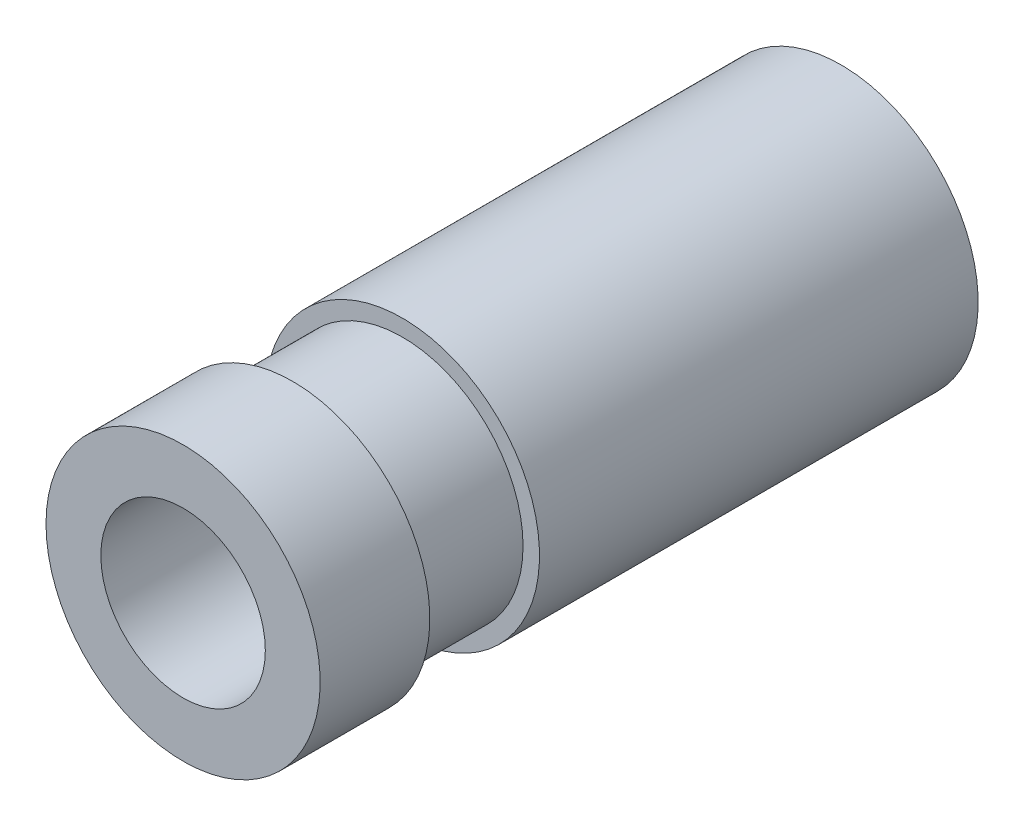
ISO-10303-21;
HEADER;
FILE_DESCRIPTION(('STEP AP214'),'2;1');
FILE_NAME('part.step','',(''),(''),'','','');
FILE_SCHEMA(('AUTOMOTIVE_DESIGN { 1 0 10303 214 1 1 1 1 }'));
ENDSEC;
DATA;
#1=APPLICATION_CONTEXT('core data for automotive mechanical design processes');
#2=APPLICATION_PROTOCOL_DEFINITION('international standard','automotive_design',2000,#1);
#3=PRODUCT_CONTEXT('',#1,'mechanical');
#4=PRODUCT('Part','Part','',(#3));
#5=PRODUCT_RELATED_PRODUCT_CATEGORY('part','',(#4));
#6=PRODUCT_DEFINITION_FORMATION('','',#4);
#7=PRODUCT_DEFINITION_CONTEXT('part definition',#1,'design');
#8=PRODUCT_DEFINITION('design','',#6,#7);
#9=PRODUCT_DEFINITION_SHAPE('','',#8);
#10=(LENGTH_UNIT() NAMED_UNIT(*) SI_UNIT(.MILLI.,.METRE.));
#11=(NAMED_UNIT(*) PLANE_ANGLE_UNIT() SI_UNIT($,.RADIAN.));
#12=(NAMED_UNIT(*) SI_UNIT($,.STERADIAN.) SOLID_ANGLE_UNIT());
#13=UNCERTAINTY_MEASURE_WITH_UNIT(LENGTH_MEASURE(1.E-05),#10,'distance_accuracy_value','');
#14=(GEOMETRIC_REPRESENTATION_CONTEXT(3) GLOBAL_UNCERTAINTY_ASSIGNED_CONTEXT((#13)) GLOBAL_UNIT_ASSIGNED_CONTEXT((#10,
#11,#12)) REPRESENTATION_CONTEXT('',''));
#15=CARTESIAN_POINT('',(0.,0.,0.));
#16=DIRECTION('',(0.,0.,1.));
#17=DIRECTION('',(1.,0.,0.));
#18=AXIS2_PLACEMENT_3D('',#15,#16,#17);
#19=CARTESIAN_POINT('',(0.,0.,7.62));
#20=DIRECTION('',(0.,0.,-1.));
#21=DIRECTION('',(-1.,0.,0.));
#22=AXIS2_PLACEMENT_3D('',#19,#20,#21);
#23=CYLINDRICAL_SURFACE('',#22,1.5875);
#24=CARTESIAN_POINT('',(0.,0.,0.));
#25=DIRECTION('',(0.,0.,1.));
#26=DIRECTION('',(1.,0.,0.));
#27=AXIS2_PLACEMENT_3D('',#24,#25,#26);
#28=CIRCLE('',#27,1.5875);
#29=CARTESIAN_POINT('',(-1.5875,0.,0.));
#30=VERTEX_POINT('',#29);
#31=EDGE_CURVE('E41',#30,#30,#28,.T.);
#32=CARTESIAN_POINT('',(0.,0.,5.08));
#33=DIRECTION('',(0.,0.,1.));
#34=DIRECTION('',(1.,0.,0.));
#35=AXIS2_PLACEMENT_3D('',#32,#33,#34);
#36=CIRCLE('',#35,1.5875);
#37=CARTESIAN_POINT('',(-1.5875,0.,5.08));
#38=VERTEX_POINT('',#37);
#39=EDGE_CURVE('E53',#38,#38,#36,.T.);
#40=CARTESIAN_POINT('',(-1.5875,0.,0.));
#41=CARTESIAN_POINT('',(-1.5875,0.,0.0529166666666667));
#42=CARTESIAN_POINT('',(-1.5875,0.,0.105833333333333));
#43=CARTESIAN_POINT('',(-1.5875,0.,0.211666666666667));
#44=CARTESIAN_POINT('',(-1.5875,0.,0.264583333333333));
#45=CARTESIAN_POINT('',(-1.5875,0.,0.370416666666667));
#46=CARTESIAN_POINT('',(-1.5875,0.,0.423333333333333));
#47=CARTESIAN_POINT('',(-1.5875,0.,0.529166666666667));
#48=CARTESIAN_POINT('',(-1.5875,0.,0.582083333333333));
#49=CARTESIAN_POINT('',(-1.5875,0.,0.687916666666667));
#50=CARTESIAN_POINT('',(-1.5875,0.,0.740833333333333));
#51=CARTESIAN_POINT('',(-1.5875,0.,0.846666666666666));
#52=CARTESIAN_POINT('',(-1.5875,0.,0.899583333333333));
#53=CARTESIAN_POINT('',(-1.5875,0.,1.00541666666667));
#54=CARTESIAN_POINT('',(-1.5875,0.,1.05833333333333));
#55=CARTESIAN_POINT('',(-1.5875,0.,1.16416666666667));
#56=CARTESIAN_POINT('',(-1.5875,0.,1.21708333333333));
#57=CARTESIAN_POINT('',(-1.5875,0.,1.32291666666667));
#58=CARTESIAN_POINT('',(-1.5875,0.,1.37583333333333));
#59=CARTESIAN_POINT('',(-1.5875,0.,1.48166666666667));
#60=CARTESIAN_POINT('',(-1.5875,0.,1.53458333333333));
#61=CARTESIAN_POINT('',(-1.5875,0.,1.64041666666667));
#62=CARTESIAN_POINT('',(-1.5875,0.,1.69333333333333));
#63=CARTESIAN_POINT('',(-1.5875,0.,1.79916666666667));
#64=CARTESIAN_POINT('',(-1.5875,0.,1.85208333333333));
#65=CARTESIAN_POINT('',(-1.5875,0.,1.95791666666667));
#66=CARTESIAN_POINT('',(-1.5875,0.,2.01083333333333));
#67=CARTESIAN_POINT('',(-1.5875,0.,2.11666666666667));
#68=CARTESIAN_POINT('',(-1.5875,0.,2.16958333333333));
#69=CARTESIAN_POINT('',(-1.5875,0.,2.27541666666667));
#70=CARTESIAN_POINT('',(-1.5875,0.,2.32833333333333));
#71=CARTESIAN_POINT('',(-1.5875,0.,2.43416666666667));
#72=CARTESIAN_POINT('',(-1.5875,0.,2.48708333333333));
#73=CARTESIAN_POINT('',(-1.5875,0.,2.59291666666667));
#74=CARTESIAN_POINT('',(-1.5875,0.,2.64583333333333));
#75=CARTESIAN_POINT('',(-1.5875,0.,2.75166666666667));
#76=CARTESIAN_POINT('',(-1.5875,0.,2.80458333333333));
#77=CARTESIAN_POINT('',(-1.5875,0.,2.91041666666667));
#78=CARTESIAN_POINT('',(-1.5875,0.,2.96333333333333));
#79=CARTESIAN_POINT('',(-1.5875,0.,3.06916666666667));
#80=CARTESIAN_POINT('',(-1.5875,0.,3.12208333333333));
#81=CARTESIAN_POINT('',(-1.5875,0.,3.22791666666667));
#82=CARTESIAN_POINT('',(-1.5875,0.,3.28083333333333));
#83=CARTESIAN_POINT('',(-1.5875,0.,3.38666666666667));
#84=CARTESIAN_POINT('',(-1.5875,0.,3.43958333333333));
#85=CARTESIAN_POINT('',(-1.5875,0.,3.54541666666667));
#86=CARTESIAN_POINT('',(-1.5875,0.,3.59833333333333));
#87=CARTESIAN_POINT('',(-1.5875,0.,3.70416666666667));
#88=CARTESIAN_POINT('',(-1.5875,0.,3.75708333333333));
#89=CARTESIAN_POINT('',(-1.5875,0.,3.86291666666667));
#90=CARTESIAN_POINT('',(-1.5875,0.,3.91583333333333));
#91=CARTESIAN_POINT('',(-1.5875,0.,4.02166666666667));
#92=CARTESIAN_POINT('',(-1.5875,0.,4.07458333333333));
#93=CARTESIAN_POINT('',(-1.5875,0.,4.18041666666667));
#94=CARTESIAN_POINT('',(-1.5875,0.,4.23333333333333));
#95=CARTESIAN_POINT('',(-1.5875,0.,4.33916666666666));
#96=CARTESIAN_POINT('',(-1.5875,0.,4.39208333333333));
#97=CARTESIAN_POINT('',(-1.5875,0.,4.49791666666667));
#98=CARTESIAN_POINT('',(-1.5875,0.,4.55083333333333));
#99=CARTESIAN_POINT('',(-1.5875,0.,4.65666666666666));
#100=CARTESIAN_POINT('',(-1.5875,0.,4.70958333333333));
#101=CARTESIAN_POINT('',(-1.5875,0.,4.81541666666666));
#102=CARTESIAN_POINT('',(-1.5875,0.,4.86833333333333));
#103=CARTESIAN_POINT('',(-1.5875,0.,4.97416666666667));
#104=CARTESIAN_POINT('',(-1.5875,0.,5.02708333333333));
#105=CARTESIAN_POINT('',(-1.5875,0.,5.08));
#106=B_SPLINE_CURVE_WITH_KNOTS('',3,(#40,#41,#42,#43,#44,#45,#46,#47,#48,#49,#50,#51,#52,#53,
#54,#55,#56,#57,#58,#59,#60,#61,#62,#63,#64,#65,#66,#67,#68,#69,#70,#71,#72,#73,#74,#75,#76,#77,
#78,#79,#80,#81,#82,#83,#84,#85,#86,#87,#88,#89,#90,#91,#92,#93,#94,#95,#96,#97,#98,#99,#100,
#101,#102,#103,#104,#105),.UNSPECIFIED.,.F.,.F.,(4,2,2,2,2,2,2,2,2,2,2,2,2,2,2,2,2,2,2,2,2,2,2,
2,2,2,2,2,2,2,2,2,4),(0.,0.15875,0.3175,0.47625,0.635,0.793749999999999,0.9525,1.11125,1.27,
1.42875,1.5875,1.74625,1.905,2.06375,2.2225,2.38125,2.54,2.69875,2.8575,3.01625,3.175,3.33375,
3.4925,3.65125,3.81,3.96875,4.1275,4.28625,4.445,4.60375,4.7625,4.92125,5.08),.UNSPECIFIED.);
#107=EDGE_CURVE('BSEAM37',#30,#38,#106,.T.);
#108=ORIENTED_EDGE('',*,*,#31,.T.);
#109=ORIENTED_EDGE('',*,*,#39,.F.);
#110=ORIENTED_EDGE('',*,*,#107,.T.);
#111=ORIENTED_EDGE('',*,*,#107,.F.);
#112=EDGE_LOOP('',(#108,#110,#109,#111));
#113=FACE_BOUND('',#112,.T.);
#114=ADVANCED_FACE('F37',(#113),#23,.T.);
#115=CARTESIAN_POINT('',(0.,0.,7.62));
#116=DIRECTION('',(0.,0.,1.));
#117=DIRECTION('',(1.,0.,0.));
#118=AXIS2_PLACEMENT_3D('',#115,#116,#117);
#119=PLANE('',#118);
#120=CARTESIAN_POINT('',(0.,0.,7.62));
#121=DIRECTION('',(0.,0.,1.));
#122=DIRECTION('',(1.,0.,0.));
#123=AXIS2_PLACEMENT_3D('',#120,#121,#122);
#124=CIRCLE('',#123,1.5875);
#125=CARTESIAN_POINT('',(-1.5875,0.,7.62));
#126=VERTEX_POINT('',#125);
#127=EDGE_CURVE('E10',#126,#126,#124,.T.);
#128=ORIENTED_EDGE('',*,*,#127,.T.);
#129=EDGE_LOOP('',(#128));
#130=FACE_BOUND('',#129,.T.);
#131=CARTESIAN_POINT('',(0.,0.,7.62));
#132=DIRECTION('',(0.,0.,1.));
#133=DIRECTION('',(1.,0.,0.));
#134=AXIS2_PLACEMENT_3D('',#131,#132,#133);
#135=CIRCLE('',#134,0.9525);
#136=CARTESIAN_POINT('',(-0.9525,0.,7.62));
#137=VERTEX_POINT('',#136);
#138=EDGE_CURVE('E48',#137,#137,#135,.T.);
#139=ORIENTED_EDGE('',*,*,#138,.F.);
#140=EDGE_LOOP('',(#139));
#141=FACE_BOUND('',#140,.T.);
#142=ADVANCED_FACE('F80',(#130,#141),#119,.T.);
#143=CARTESIAN_POINT('',(0.,0.,0.));
#144=DIRECTION('',(0.,0.,1.));
#145=DIRECTION('',(1.,0.,0.));
#146=AXIS2_PLACEMENT_3D('',#143,#144,#145);
#147=PLANE('',#146);
#148=ORIENTED_EDGE('',*,*,#31,.F.);
#149=EDGE_LOOP('',(#148));
#150=FACE_BOUND('',#149,.T.);
#151=CARTESIAN_POINT('',(0.,0.,0.));
#152=DIRECTION('',(0.,0.,1.));
#153=DIRECTION('',(1.,0.,0.));
#154=AXIS2_PLACEMENT_3D('',#151,#152,#153);
#155=CIRCLE('',#154,0.9525);
#156=CARTESIAN_POINT('',(-0.9525,0.,0.));
#157=VERTEX_POINT('',#156);
#158=EDGE_CURVE('E50',#157,#157,#155,.T.);
#159=ORIENTED_EDGE('',*,*,#158,.T.);
#160=EDGE_LOOP('',(#159));
#161=FACE_BOUND('',#160,.T.);
#162=ADVANCED_FACE('F87',(#150,#161),#147,.F.);
#163=CARTESIAN_POINT('',(0.,0.,6.35));
#164=DIRECTION('',(0.,0.,1.));
#165=DIRECTION('',(1.,0.,0.));
#166=AXIS2_PLACEMENT_3D('',#163,#164,#165);
#167=CIRCLE('',#166,1.5875);
#168=CARTESIAN_POINT('',(-1.5875,0.,6.35));
#169=VERTEX_POINT('',#168);
#170=EDGE_CURVE('E56',#169,#169,#167,.T.);
#171=CARTESIAN_POINT('',(-1.5875,0.,6.35));
#172=CARTESIAN_POINT('',(-1.5875,0.,6.36322916666667));
#173=CARTESIAN_POINT('',(-1.5875,0.,6.37645833333333));
#174=CARTESIAN_POINT('',(-1.5875,0.,6.40291666666667));
#175=CARTESIAN_POINT('',(-1.5875,0.,6.41614583333333));
#176=CARTESIAN_POINT('',(-1.5875,0.,6.44260416666666));
#177=CARTESIAN_POINT('',(-1.5875,0.,6.45583333333333));
#178=CARTESIAN_POINT('',(-1.5875,0.,6.48229166666667));
#179=CARTESIAN_POINT('',(-1.5875,0.,6.49552083333333));
#180=CARTESIAN_POINT('',(-1.5875,0.,6.52197916666667));
#181=CARTESIAN_POINT('',(-1.5875,0.,6.53520833333333));
#182=CARTESIAN_POINT('',(-1.5875,0.,6.56166666666667));
#183=CARTESIAN_POINT('',(-1.5875,0.,6.57489583333333));
#184=CARTESIAN_POINT('',(-1.5875,0.,6.60135416666667));
#185=CARTESIAN_POINT('',(-1.5875,0.,6.61458333333333));
#186=CARTESIAN_POINT('',(-1.5875,0.,6.64104166666666));
#187=CARTESIAN_POINT('',(-1.5875,0.,6.65427083333333));
#188=CARTESIAN_POINT('',(-1.5875,0.,6.68072916666667));
#189=CARTESIAN_POINT('',(-1.5875,0.,6.69395833333333));
#190=CARTESIAN_POINT('',(-1.5875,0.,6.72041666666667));
#191=CARTESIAN_POINT('',(-1.5875,0.,6.73364583333333));
#192=CARTESIAN_POINT('',(-1.5875,0.,6.76010416666667));
#193=CARTESIAN_POINT('',(-1.5875,0.,6.77333333333333));
#194=CARTESIAN_POINT('',(-1.5875,0.,6.79979166666666));
#195=CARTESIAN_POINT('',(-1.5875,0.,6.81302083333333));
#196=CARTESIAN_POINT('',(-1.5875,0.,6.83947916666667));
#197=CARTESIAN_POINT('',(-1.5875,0.,6.85270833333333));
#198=CARTESIAN_POINT('',(-1.5875,0.,6.87916666666667));
#199=CARTESIAN_POINT('',(-1.5875,0.,6.89239583333333));
#200=CARTESIAN_POINT('',(-1.5875,0.,6.91885416666666));
#201=CARTESIAN_POINT('',(-1.5875,0.,6.93208333333333));
#202=CARTESIAN_POINT('',(-1.5875,0.,6.95854166666667));
#203=CARTESIAN_POINT('',(-1.5875,0.,6.97177083333333));
#204=CARTESIAN_POINT('',(-1.5875,0.,6.99822916666667));
#205=CARTESIAN_POINT('',(-1.5875,0.,7.01145833333333));
#206=CARTESIAN_POINT('',(-1.5875,0.,7.03791666666667));
#207=CARTESIAN_POINT('',(-1.5875,0.,7.05114583333333));
#208=CARTESIAN_POINT('',(-1.5875,0.,7.07760416666667));
#209=CARTESIAN_POINT('',(-1.5875,0.,7.09083333333333));
#210=CARTESIAN_POINT('',(-1.5875,0.,7.11729166666666));
#211=CARTESIAN_POINT('',(-1.5875,0.,7.13052083333333));
#212=CARTESIAN_POINT('',(-1.5875,0.,7.15697916666667));
#213=CARTESIAN_POINT('',(-1.5875,0.,7.17020833333333));
#214=CARTESIAN_POINT('',(-1.5875,0.,7.19666666666667));
#215=CARTESIAN_POINT('',(-1.5875,0.,7.20989583333333));
#216=CARTESIAN_POINT('',(-1.5875,0.,7.23635416666666));
#217=CARTESIAN_POINT('',(-1.5875,0.,7.24958333333333));
#218=CARTESIAN_POINT('',(-1.5875,0.,7.27604166666667));
#219=CARTESIAN_POINT('',(-1.5875,0.,7.28927083333333));
#220=CARTESIAN_POINT('',(-1.5875,0.,7.31572916666667));
#221=CARTESIAN_POINT('',(-1.5875,0.,7.32895833333333));
#222=CARTESIAN_POINT('',(-1.5875,0.,7.35541666666667));
#223=CARTESIAN_POINT('',(-1.5875,0.,7.36864583333333));
#224=CARTESIAN_POINT('',(-1.5875,0.,7.39510416666667));
#225=CARTESIAN_POINT('',(-1.5875,0.,7.40833333333333));
#226=CARTESIAN_POINT('',(-1.5875,0.,7.43479166666666));
#227=CARTESIAN_POINT('',(-1.5875,0.,7.44802083333333));
#228=CARTESIAN_POINT('',(-1.5875,0.,7.47447916666667));
#229=CARTESIAN_POINT('',(-1.5875,0.,7.48770833333333));
#230=CARTESIAN_POINT('',(-1.5875,0.,7.51416666666667));
#231=CARTESIAN_POINT('',(-1.5875,0.,7.52739583333333));
#232=CARTESIAN_POINT('',(-1.5875,0.,7.55385416666667));
#233=CARTESIAN_POINT('',(-1.5875,0.,7.56708333333333));
#234=CARTESIAN_POINT('',(-1.5875,0.,7.59354166666667));
#235=CARTESIAN_POINT('',(-1.5875,0.,7.60677083333333));
#236=CARTESIAN_POINT('',(-1.5875,0.,7.62));
#237=B_SPLINE_CURVE_WITH_KNOTS('',3,(#171,#172,#173,#174,#175,#176,#177,#178,#179,#180,#181,
#182,#183,#184,#185,#186,#187,#188,#189,#190,#191,#192,#193,#194,#195,#196,#197,#198,#199,#200,
#201,#202,#203,#204,#205,#206,#207,#208,#209,#210,#211,#212,#213,#214,#215,#216,#217,#218,#219,
#220,#221,#222,#223,#224,#225,#226,#227,#228,#229,#230,#231,#232,#233,#234,#235,#236),
.UNSPECIFIED.,.F.,.F.,(4,2,2,2,2,2,2,2,2,2,2,2,2,2,2,2,2,2,2,2,2,2,2,2,2,2,2,2,2,2,2,2,4),(0.,
0.0396874999999998,0.0793749999999996,0.1190625,0.15875,0.1984375,0.238125,0.277812499999999,
0.3175,0.3571875,0.396875,0.436562499999999,0.47625,0.5159375,0.555625,0.595312499999999,0.635,
0.6746875,0.714375,0.7540625,0.79375,0.8334375,0.873125,0.9128125,0.9525,0.9921875,1.031875,
1.0715625,1.11125,1.1509375,1.190625,1.2303125,1.27),.UNSPECIFIED.);
#238=EDGE_CURVE('BSEAM39',#169,#126,#237,.T.);
#239=ORIENTED_EDGE('',*,*,#170,.T.);
#240=ORIENTED_EDGE('',*,*,#127,.F.);
#241=ORIENTED_EDGE('',*,*,#238,.T.);
#242=ORIENTED_EDGE('',*,*,#238,.F.);
#243=EDGE_LOOP('',(#239,#241,#240,#242));
#244=FACE_BOUND('',#243,.T.);
#245=ADVANCED_FACE('F39',(#244),#23,.T.);
#246=CARTESIAN_POINT('',(0.,0.,7.62));
#247=DIRECTION('',(0.,0.,-1.));
#248=DIRECTION('',(-1.,0.,0.));
#249=AXIS2_PLACEMENT_3D('',#246,#247,#248);
#250=CYLINDRICAL_SURFACE('',#249,0.9525);
#251=CARTESIAN_POINT('',(-0.9525,0.,7.62));
#252=CARTESIAN_POINT('',(-0.9525,0.,7.540625));
#253=CARTESIAN_POINT('',(-0.9525,0.,7.46125));
#254=CARTESIAN_POINT('',(-0.9525,0.,7.3025));
#255=CARTESIAN_POINT('',(-0.9525,0.,7.223125));
#256=CARTESIAN_POINT('',(-0.9525,0.,7.064375));
#257=CARTESIAN_POINT('',(-0.9525,0.,6.985));
#258=CARTESIAN_POINT('',(-0.9525,0.,6.82625));
#259=CARTESIAN_POINT('',(-0.9525,0.,6.746875));
#260=CARTESIAN_POINT('',(-0.9525,0.,6.588125));
#261=CARTESIAN_POINT('',(-0.9525,0.,6.50875));
#262=CARTESIAN_POINT('',(-0.9525,0.,6.35));
#263=CARTESIAN_POINT('',(-0.9525,0.,6.270625));
#264=CARTESIAN_POINT('',(-0.9525,0.,6.111875));
#265=CARTESIAN_POINT('',(-0.9525,0.,6.0325));
#266=CARTESIAN_POINT('',(-0.9525,0.,5.87375));
#267=CARTESIAN_POINT('',(-0.9525,0.,5.794375));
#268=CARTESIAN_POINT('',(-0.9525,0.,5.635625));
#269=CARTESIAN_POINT('',(-0.9525,0.,5.55625));
#270=CARTESIAN_POINT('',(-0.9525,0.,5.3975));
#271=CARTESIAN_POINT('',(-0.9525,0.,5.318125));
#272=CARTESIAN_POINT('',(-0.9525,0.,5.159375));
#273=CARTESIAN_POINT('',(-0.9525,0.,5.08));
#274=CARTESIAN_POINT('',(-0.9525,0.,4.92125));
#275=CARTESIAN_POINT('',(-0.9525,0.,4.841875));
#276=CARTESIAN_POINT('',(-0.9525,0.,4.683125));
#277=CARTESIAN_POINT('',(-0.9525,0.,4.60375));
#278=CARTESIAN_POINT('',(-0.9525,0.,4.445));
#279=CARTESIAN_POINT('',(-0.9525,0.,4.365625));
#280=CARTESIAN_POINT('',(-0.9525,0.,4.206875));
#281=CARTESIAN_POINT('',(-0.9525,0.,4.1275));
#282=CARTESIAN_POINT('',(-0.9525,0.,3.96875));
#283=CARTESIAN_POINT('',(-0.9525,0.,3.889375));
#284=CARTESIAN_POINT('',(-0.9525,0.,3.730625));
#285=CARTESIAN_POINT('',(-0.9525,0.,3.65125));
#286=CARTESIAN_POINT('',(-0.9525,0.,3.4925));
#287=CARTESIAN_POINT('',(-0.9525,0.,3.413125));
#288=CARTESIAN_POINT('',(-0.9525,0.,3.254375));
#289=CARTESIAN_POINT('',(-0.9525,0.,3.175));
#290=CARTESIAN_POINT('',(-0.9525,0.,3.01625));
#291=CARTESIAN_POINT('',(-0.9525,0.,2.936875));
#292=CARTESIAN_POINT('',(-0.9525,0.,2.778125));
#293=CARTESIAN_POINT('',(-0.9525,0.,2.69875));
#294=CARTESIAN_POINT('',(-0.9525,0.,2.54));
#295=CARTESIAN_POINT('',(-0.9525,0.,2.460625));
#296=CARTESIAN_POINT('',(-0.9525,0.,2.301875));
#297=CARTESIAN_POINT('',(-0.9525,0.,2.2225));
#298=CARTESIAN_POINT('',(-0.9525,0.,2.06375));
#299=CARTESIAN_POINT('',(-0.9525,0.,1.984375));
#300=CARTESIAN_POINT('',(-0.9525,0.,1.825625));
#301=CARTESIAN_POINT('',(-0.9525,0.,1.74625));
#302=CARTESIAN_POINT('',(-0.9525,0.,1.5875));
#303=CARTESIAN_POINT('',(-0.9525,0.,1.508125));
#304=CARTESIAN_POINT('',(-0.9525,0.,1.349375));
#305=CARTESIAN_POINT('',(-0.9525,0.,1.27));
#306=CARTESIAN_POINT('',(-0.9525,0.,1.11125));
#307=CARTESIAN_POINT('',(-0.9525,0.,1.031875));
#308=CARTESIAN_POINT('',(-0.9525,0.,0.873125));
#309=CARTESIAN_POINT('',(-0.9525,0.,0.79375));
#310=CARTESIAN_POINT('',(-0.9525,0.,0.635));
#311=CARTESIAN_POINT('',(-0.9525,0.,0.555625));
#312=CARTESIAN_POINT('',(-0.9525,0.,0.396875));
#313=CARTESIAN_POINT('',(-0.9525,0.,0.3175));
#314=CARTESIAN_POINT('',(-0.9525,0.,0.15875));
#315=CARTESIAN_POINT('',(-0.9525,0.,0.0793749999999999));
#316=CARTESIAN_POINT('',(-0.9525,0.,0.));
#317=B_SPLINE_CURVE_WITH_KNOTS('',3,(#251,#252,#253,#254,#255,#256,#257,#258,#259,#260,#261,
#262,#263,#264,#265,#266,#267,#268,#269,#270,#271,#272,#273,#274,#275,#276,#277,#278,#279,#280,
#281,#282,#283,#284,#285,#286,#287,#288,#289,#290,#291,#292,#293,#294,#295,#296,#297,#298,#299,
#300,#301,#302,#303,#304,#305,#306,#307,#308,#309,#310,#311,#312,#313,#314,#315,#316),
.UNSPECIFIED.,.F.,.F.,(4,2,2,2,2,2,2,2,2,2,2,2,2,2,2,2,2,2,2,2,2,2,2,2,2,2,2,2,2,2,2,2,4),(0.,
0.238125,0.47625,0.714375000000001,0.9525,1.190625,1.42875,1.666875,1.905,2.143125,2.38125,
2.619375,2.8575,3.095625,3.33375,3.571875,3.81,4.048125,4.28625,4.524375,4.7625,5.000625,
5.23875,5.476875,5.715,5.953125,6.19125,6.429375,6.6675,6.905625,7.14375,7.381875,7.62),.UNSPECIFIED.);
#318=EDGE_CURVE('BSEAM75',#137,#157,#317,.T.);
#319=ORIENTED_EDGE('',*,*,#138,.T.);
#320=ORIENTED_EDGE('',*,*,#158,.F.);
#321=ORIENTED_EDGE('',*,*,#318,.T.);
#322=ORIENTED_EDGE('',*,*,#318,.F.);
#323=EDGE_LOOP('',(#319,#321,#320,#322));
#324=FACE_BOUND('',#323,.T.);
#325=ADVANCED_FACE('F75',(#324),#250,.F.);
#326=CARTESIAN_POINT('',(0.,0.,5.08));
#327=DIRECTION('',(0.,0.,1.));
#328=DIRECTION('',(1.,0.,0.));
#329=AXIS2_PLACEMENT_3D('',#326,#327,#328);
#330=PLANE('',#329);
#331=CARTESIAN_POINT('',(0.,0.,5.08));
#332=DIRECTION('',(0.,0.,1.));
#333=DIRECTION('',(1.,0.,0.));
#334=AXIS2_PLACEMENT_3D('',#331,#332,#333);
#335=CIRCLE('',#334,1.397);
#336=CARTESIAN_POINT('',(1.397,0.,5.08));
#337=VERTEX_POINT('',#336);
#338=EDGE_CURVE('E59',#337,#337,#335,.T.);
#339=ORIENTED_EDGE('',*,*,#338,.F.);
#340=EDGE_LOOP('',(#339));
#341=FACE_BOUND('',#340,.T.);
#342=ORIENTED_EDGE('',*,*,#39,.T.);
#343=EDGE_LOOP('',(#342));
#344=FACE_BOUND('',#343,.T.);
#345=ADVANCED_FACE('F71',(#341,#344),#330,.T.);
#346=CARTESIAN_POINT('',(0.,0.,6.35));
#347=DIRECTION('',(0.,0.,1.));
#348=DIRECTION('',(1.,0.,0.));
#349=AXIS2_PLACEMENT_3D('',#346,#347,#348);
#350=PLANE('',#349);
#351=CARTESIAN_POINT('',(0.,0.,6.35));
#352=DIRECTION('',(0.,0.,1.));
#353=DIRECTION('',(1.,0.,0.));
#354=AXIS2_PLACEMENT_3D('',#351,#352,#353);
#355=CIRCLE('',#354,1.397);
#356=CARTESIAN_POINT('',(1.397,0.,6.35));
#357=VERTEX_POINT('',#356);
#358=EDGE_CURVE('E62',#357,#357,#355,.T.);
#359=ORIENTED_EDGE('',*,*,#358,.T.);
#360=EDGE_LOOP('',(#359));
#361=FACE_BOUND('',#360,.T.);
#362=ORIENTED_EDGE('',*,*,#170,.F.);
#363=EDGE_LOOP('',(#362));
#364=FACE_BOUND('',#363,.T.);
#365=ADVANCED_FACE('F74',(#361,#364),#350,.F.);
#366=CARTESIAN_POINT('',(0.,0.,5.08));
#367=DIRECTION('',(0.,0.,1.));
#368=DIRECTION('',(1.,0.,0.));
#369=AXIS2_PLACEMENT_3D('',#366,#367,#368);
#370=CYLINDRICAL_SURFACE('',#369,1.397);
#371=ORIENTED_EDGE('',*,*,#338,.T.);
#372=EDGE_LOOP('',(#371));
#373=FACE_BOUND('',#372,.T.);
#374=ORIENTED_EDGE('',*,*,#358,.F.);
#375=EDGE_LOOP('',(#374));
#376=FACE_BOUND('',#375,.T.);
#377=ADVANCED_FACE('F68',(#373,#376),#370,.T.);
#378=CLOSED_SHELL('',(#114,#142,#162,#245,#325,#345,#365,#377));
#379=MANIFOLD_SOLID_BREP('B2',#378);
#380=ADVANCED_BREP_SHAPE_REPRESENTATION('',(#18,#379),#14);
#381=SHAPE_DEFINITION_REPRESENTATION(#9,#380);
ENDSEC;
END-ISO-10303-21;
